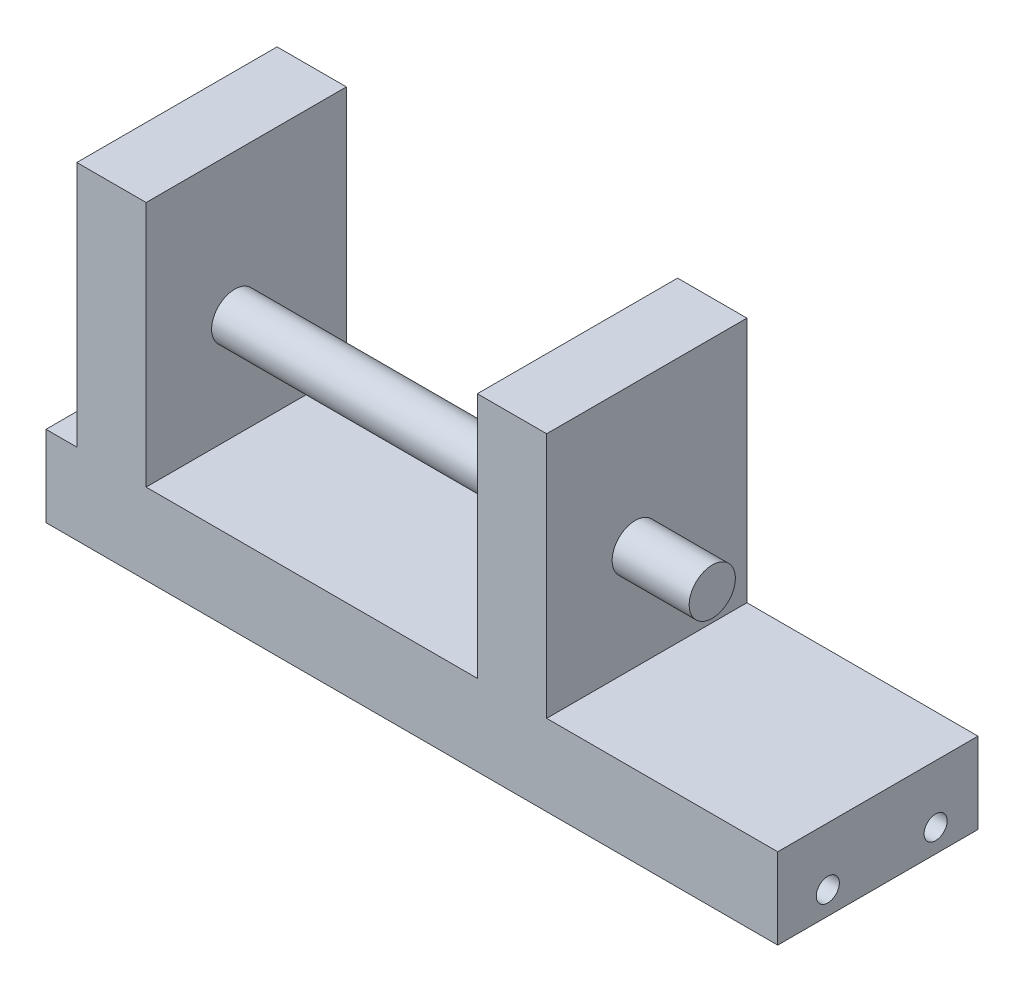
ISO-10303-21;
HEADER;
FILE_DESCRIPTION(('STEP AP214'),'2;1');
FILE_NAME('part.step','',(''),(''),'','','');
FILE_SCHEMA(('AUTOMOTIVE_DESIGN { 1 0 10303 214 1 1 1 1 }'));
ENDSEC;
DATA;
#1=APPLICATION_CONTEXT('core data for automotive mechanical design processes');
#2=APPLICATION_PROTOCOL_DEFINITION('international standard','automotive_design',2000,#1);
#3=PRODUCT_CONTEXT('',#1,'mechanical');
#4=PRODUCT('Part','Part','',(#3));
#5=PRODUCT_RELATED_PRODUCT_CATEGORY('part','',(#4));
#6=PRODUCT_DEFINITION_FORMATION('','',#4);
#7=PRODUCT_DEFINITION_CONTEXT('part definition',#1,'design');
#8=PRODUCT_DEFINITION('design','',#6,#7);
#9=PRODUCT_DEFINITION_SHAPE('','',#8);
#10=(LENGTH_UNIT() NAMED_UNIT(*) SI_UNIT(.MILLI.,.METRE.));
#11=(NAMED_UNIT(*) PLANE_ANGLE_UNIT() SI_UNIT($,.RADIAN.));
#12=(NAMED_UNIT(*) SI_UNIT($,.STERADIAN.) SOLID_ANGLE_UNIT());
#13=UNCERTAINTY_MEASURE_WITH_UNIT(LENGTH_MEASURE(1.E-05),#10,'distance_accuracy_value','');
#14=(GEOMETRIC_REPRESENTATION_CONTEXT(3) GLOBAL_UNCERTAINTY_ASSIGNED_CONTEXT((#13)) GLOBAL_UNIT_ASSIGNED_CONTEXT((#10,
#11,#12)) REPRESENTATION_CONTEXT('',''));
#15=CARTESIAN_POINT('',(0.,0.,0.));
#16=DIRECTION('',(0.,0.,1.));
#17=DIRECTION('',(1.,0.,0.));
#18=AXIS2_PLACEMENT_3D('',#15,#16,#17);
#19=CARTESIAN_POINT('',(-95.,10.5,26.));
#20=DIRECTION('',(0.,1.,0.));
#21=DIRECTION('',(0.,0.,1.));
#22=AXIS2_PLACEMENT_3D('',#19,#20,#21);
#23=PLANE('',#22);
#24=DIRECTION('',(1.,0.,0.));
#25=VECTOR('',#24,1.);
#26=CARTESIAN_POINT('',(-95.,10.5,26.));
#27=LINE('',#26,#25);
#28=CARTESIAN_POINT('',(-95.,10.5,26.));
#29=VERTEX_POINT('',#28);
#30=CARTESIAN_POINT('',(-91.,10.5,26.));
#31=VERTEX_POINT('',#30);
#32=EDGE_CURVE('E43',#29,#31,#27,.T.);
#33=ORIENTED_EDGE('',*,*,#32,.T.);
#34=DIRECTION('',(0.,0.,1.));
#35=VECTOR('',#34,1.);
#36=CARTESIAN_POINT('',(-91.,10.5,0.));
#37=LINE('',#36,#35);
#38=CARTESIAN_POINT('',(-91.,10.5,0.));
#39=VERTEX_POINT('',#38);
#40=EDGE_CURVE('E146',#39,#31,#37,.T.);
#41=ORIENTED_EDGE('',*,*,#40,.F.);
#42=DIRECTION('',(1.,0.,0.));
#43=VECTOR('',#42,1.);
#44=CARTESIAN_POINT('',(-95.,10.5,0.));
#45=LINE('',#44,#43);
#46=CARTESIAN_POINT('',(-95.,10.5,0.));
#47=VERTEX_POINT('',#46);
#48=EDGE_CURVE('E217',#47,#39,#45,.T.);
#49=ORIENTED_EDGE('',*,*,#48,.F.);
#50=DIRECTION('',(0.,0.,1.));
#51=VECTOR('',#50,1.);
#52=CARTESIAN_POINT('',(-95.,10.5,26.));
#53=LINE('',#52,#51);
#54=EDGE_CURVE('E200',#47,#29,#53,.T.);
#55=ORIENTED_EDGE('',*,*,#54,.T.);
#56=EDGE_LOOP('',(#33,#41,#49,#55));
#57=FACE_BOUND('',#56,.T.);
#58=ADVANCED_FACE('F35',(#57),#23,.T.);
#59=CARTESIAN_POINT('',(-82.,10.5,0.));
#60=VERTEX_POINT('',#59);
#61=CARTESIAN_POINT('',(-39.,10.5,0.));
#62=VERTEX_POINT('',#61);
#63=EDGE_CURVE('E220',#60,#62,#45,.T.);
#64=ORIENTED_EDGE('',*,*,#63,.F.);
#65=DIRECTION('',(0.,0.,-1.));
#66=VECTOR('',#65,1.);
#67=CARTESIAN_POINT('',(-82.,10.5,0.));
#68=LINE('',#67,#66);
#69=CARTESIAN_POINT('',(-82.,10.5,26.));
#70=VERTEX_POINT('',#69);
#71=EDGE_CURVE('E142',#70,#60,#68,.T.);
#72=ORIENTED_EDGE('',*,*,#71,.F.);
#73=CARTESIAN_POINT('',(-39.,10.5,26.));
#74=VERTEX_POINT('',#73);
#75=EDGE_CURVE('E215',#70,#74,#27,.T.);
#76=ORIENTED_EDGE('',*,*,#75,.T.);
#77=DIRECTION('',(0.,0.,1.));
#78=VECTOR('',#77,1.);
#79=CARTESIAN_POINT('',(-39.,10.5,0.));
#80=LINE('',#79,#78);
#81=EDGE_CURVE('E148',#62,#74,#80,.T.);
#82=ORIENTED_EDGE('',*,*,#81,.F.);
#83=EDGE_LOOP('',(#64,#72,#76,#82));
#84=FACE_BOUND('',#83,.T.);
#85=ADVANCED_FACE('F238',(#84),#23,.T.);
#86=CARTESIAN_POINT('',(-95.,10.5,26.));
#87=DIRECTION('',(0.,0.,1.));
#88=DIRECTION('',(1.,0.,0.));
#89=AXIS2_PLACEMENT_3D('',#86,#87,#88);
#90=PLANE('',#89);
#91=DIRECTION('',(0.,-1.,0.));
#92=VECTOR('',#91,1.);
#93=CARTESIAN_POINT('',(0.,10.5,26.));
#94=LINE('',#93,#92);
#95=CARTESIAN_POINT('',(0.,10.5,26.));
#96=VERTEX_POINT('',#95);
#97=CARTESIAN_POINT('',(0.,0.,26.));
#98=VERTEX_POINT('',#97);
#99=EDGE_CURVE('E187',#96,#98,#94,.T.);
#100=ORIENTED_EDGE('',*,*,#99,.F.);
#101=CARTESIAN_POINT('',(-30.,10.5,26.));
#102=VERTEX_POINT('',#101);
#103=EDGE_CURVE('E216',#102,#96,#27,.T.);
#104=ORIENTED_EDGE('',*,*,#103,.F.);
#105=DIRECTION('',(0.,-1.,0.));
#106=VECTOR('',#105,1.);
#107=CARTESIAN_POINT('',(-30.,42.5,26.));
#108=LINE('',#107,#106);
#109=CARTESIAN_POINT('',(-30.,42.5,26.));
#110=VERTEX_POINT('',#109);
#111=EDGE_CURVE('E171',#110,#102,#108,.T.);
#112=ORIENTED_EDGE('',*,*,#111,.F.);
#113=DIRECTION('',(1.,0.,0.));
#114=VECTOR('',#113,1.);
#115=CARTESIAN_POINT('',(-39.,42.5,26.));
#116=LINE('',#115,#114);
#117=CARTESIAN_POINT('',(-39.,42.5,26.));
#118=VERTEX_POINT('',#117);
#119=EDGE_CURVE('E158',#118,#110,#116,.T.);
#120=ORIENTED_EDGE('',*,*,#119,.F.);
#121=DIRECTION('',(0.,-1.,0.));
#122=VECTOR('',#121,1.);
#123=CARTESIAN_POINT('',(-39.,42.5,26.));
#124=LINE('',#123,#122);
#125=EDGE_CURVE('E174',#118,#74,#124,.T.);
#126=ORIENTED_EDGE('',*,*,#125,.T.);
#127=ORIENTED_EDGE('',*,*,#75,.F.);
#128=DIRECTION('',(0.,-1.,0.));
#129=VECTOR('',#128,1.);
#130=CARTESIAN_POINT('',(-82.,42.5,26.));
#131=LINE('',#130,#129);
#132=CARTESIAN_POINT('',(-82.,42.5,26.));
#133=VERTEX_POINT('',#132);
#134=EDGE_CURVE('E131',#133,#70,#131,.T.);
#135=ORIENTED_EDGE('',*,*,#134,.F.);
#136=DIRECTION('',(1.,0.,0.));
#137=VECTOR('',#136,1.);
#138=CARTESIAN_POINT('',(-91.,42.5,26.));
#139=LINE('',#138,#137);
#140=CARTESIAN_POINT('',(-91.,42.5,26.));
#141=VERTEX_POINT('',#140);
#142=EDGE_CURVE('E124',#141,#133,#139,.T.);
#143=ORIENTED_EDGE('',*,*,#142,.F.);
#144=DIRECTION('',(0.,-1.,0.));
#145=VECTOR('',#144,1.);
#146=CARTESIAN_POINT('',(-91.,42.5,26.));
#147=LINE('',#146,#145);
#148=EDGE_CURVE('E128',#141,#31,#147,.T.);
#149=ORIENTED_EDGE('',*,*,#148,.T.);
#150=ORIENTED_EDGE('',*,*,#32,.F.);
#151=DIRECTION('',(0.,-1.,0.));
#152=VECTOR('',#151,1.);
#153=CARTESIAN_POINT('',(-95.,10.5,26.));
#154=LINE('',#153,#152);
#155=CARTESIAN_POINT('',(-95.,0.,26.));
#156=VERTEX_POINT('',#155);
#157=EDGE_CURVE('E190',#29,#156,#154,.T.);
#158=ORIENTED_EDGE('',*,*,#157,.T.);
#159=DIRECTION('',(1.,0.,0.));
#160=VECTOR('',#159,1.);
#161=CARTESIAN_POINT('',(-95.,0.,26.));
#162=LINE('',#161,#160);
#163=EDGE_CURVE('E203',#156,#98,#162,.T.);
#164=ORIENTED_EDGE('',*,*,#163,.T.);
#165=EDGE_LOOP('',(#100,#104,#112,#120,#126,#127,#135,#143,#149,#150,#158,#164));
#166=FACE_BOUND('',#165,.T.);
#167=ADVANCED_FACE('F37',(#166),#90,.T.);
#168=DIRECTION('',(0.,0.,-1.));
#169=VECTOR('',#168,1.);
#170=CARTESIAN_POINT('',(-30.,10.5,0.));
#171=LINE('',#170,#169);
#172=CARTESIAN_POINT('',(-30.,10.5,0.));
#173=VERTEX_POINT('',#172);
#174=EDGE_CURVE('E58',#102,#173,#171,.T.);
#175=ORIENTED_EDGE('',*,*,#174,.F.);
#176=ORIENTED_EDGE('',*,*,#103,.T.);
#177=DIRECTION('',(0.,0.,1.));
#178=VECTOR('',#177,1.);
#179=CARTESIAN_POINT('',(0.,10.5,26.));
#180=LINE('',#179,#178);
#181=CARTESIAN_POINT('',(0.,10.5,0.));
#182=VERTEX_POINT('',#181);
#183=EDGE_CURVE('E194',#182,#96,#180,.T.);
#184=ORIENTED_EDGE('',*,*,#183,.F.);
#185=EDGE_CURVE('E221',#173,#182,#45,.T.);
#186=ORIENTED_EDGE('',*,*,#185,.F.);
#187=EDGE_LOOP('',(#175,#176,#184,#186));
#188=FACE_BOUND('',#187,.T.);
#189=ADVANCED_FACE('F232',(#188),#23,.T.);
#190=CARTESIAN_POINT('',(-95.,10.5,0.));
#191=DIRECTION('',(0.,0.,-1.));
#192=DIRECTION('',(-1.,0.,0.));
#193=AXIS2_PLACEMENT_3D('',#190,#191,#192);
#194=PLANE('',#193);
#195=DIRECTION('',(0.,1.,0.));
#196=VECTOR('',#195,1.);
#197=CARTESIAN_POINT('',(0.,10.5,0.));
#198=LINE('',#197,#196);
#199=CARTESIAN_POINT('',(0.,0.,0.));
#200=VERTEX_POINT('',#199);
#201=EDGE_CURVE('E209',#200,#182,#198,.T.);
#202=ORIENTED_EDGE('',*,*,#201,.F.);
#203=DIRECTION('',(1.,0.,0.));
#204=VECTOR('',#203,1.);
#205=CARTESIAN_POINT('',(-95.,0.,0.));
#206=LINE('',#205,#204);
#207=CARTESIAN_POINT('',(-95.,0.,0.));
#208=VERTEX_POINT('',#207);
#209=EDGE_CURVE('E222',#208,#200,#206,.T.);
#210=ORIENTED_EDGE('',*,*,#209,.F.);
#211=DIRECTION('',(0.,1.,0.));
#212=VECTOR('',#211,1.);
#213=CARTESIAN_POINT('',(-95.,10.5,0.));
#214=LINE('',#213,#212);
#215=EDGE_CURVE('E197',#208,#47,#214,.T.);
#216=ORIENTED_EDGE('',*,*,#215,.T.);
#217=ORIENTED_EDGE('',*,*,#48,.T.);
#218=DIRECTION('',(0.,-1.,0.));
#219=VECTOR('',#218,1.);
#220=CARTESIAN_POINT('',(-91.,42.5,0.));
#221=LINE('',#220,#219);
#222=CARTESIAN_POINT('',(-91.,42.5,0.));
#223=VERTEX_POINT('',#222);
#224=EDGE_CURVE('E430',#223,#39,#221,.T.);
#225=ORIENTED_EDGE('',*,*,#224,.F.);
#226=DIRECTION('',(-1.,0.,0.));
#227=VECTOR('',#226,1.);
#228=CARTESIAN_POINT('',(-91.,42.5,0.));
#229=LINE('',#228,#227);
#230=CARTESIAN_POINT('',(-82.,42.5,0.));
#231=VERTEX_POINT('',#230);
#232=EDGE_CURVE('E139',#231,#223,#229,.T.);
#233=ORIENTED_EDGE('',*,*,#232,.F.);
#234=DIRECTION('',(0.,-1.,0.));
#235=VECTOR('',#234,1.);
#236=CARTESIAN_POINT('',(-82.,42.5,0.));
#237=LINE('',#236,#235);
#238=EDGE_CURVE('E50',#231,#60,#237,.T.);
#239=ORIENTED_EDGE('',*,*,#238,.T.);
#240=ORIENTED_EDGE('',*,*,#63,.T.);
#241=DIRECTION('',(0.,-1.,0.));
#242=VECTOR('',#241,1.);
#243=CARTESIAN_POINT('',(-39.,42.5,0.));
#244=LINE('',#243,#242);
#245=CARTESIAN_POINT('',(-39.,42.5,0.));
#246=VERTEX_POINT('',#245);
#247=EDGE_CURVE('E163',#246,#62,#244,.T.);
#248=ORIENTED_EDGE('',*,*,#247,.F.);
#249=DIRECTION('',(-1.,0.,0.));
#250=VECTOR('',#249,1.);
#251=CARTESIAN_POINT('',(-39.,42.5,0.));
#252=LINE('',#251,#250);
#253=CARTESIAN_POINT('',(-30.,42.5,0.));
#254=VERTEX_POINT('',#253);
#255=EDGE_CURVE('E162',#254,#246,#252,.T.);
#256=ORIENTED_EDGE('',*,*,#255,.F.);
#257=DIRECTION('',(0.,-1.,0.));
#258=VECTOR('',#257,1.);
#259=CARTESIAN_POINT('',(-30.,42.5,0.));
#260=LINE('',#259,#258);
#261=EDGE_CURVE('E168',#254,#173,#260,.T.);
#262=ORIENTED_EDGE('',*,*,#261,.T.);
#263=ORIENTED_EDGE('',*,*,#185,.T.);
#264=EDGE_LOOP('',(#202,#210,#216,#217,#225,#233,#239,#240,#248,#256,#262,#263));
#265=FACE_BOUND('',#264,.T.);
#266=ADVANCED_FACE('F245',(#265),#194,.T.);
#267=CARTESIAN_POINT('',(-95.,0.,26.));
#268=DIRECTION('',(0.,-1.,0.));
#269=DIRECTION('',(0.,0.,-1.));
#270=AXIS2_PLACEMENT_3D('',#267,#268,#269);
#271=PLANE('',#270);
#272=DIRECTION('',(0.,0.,-1.));
#273=VECTOR('',#272,1.);
#274=CARTESIAN_POINT('',(0.,0.,26.));
#275=LINE('',#274,#273);
#276=EDGE_CURVE('E206',#98,#200,#275,.T.);
#277=ORIENTED_EDGE('',*,*,#276,.F.);
#278=ORIENTED_EDGE('',*,*,#163,.F.);
#279=DIRECTION('',(0.,0.,-1.));
#280=VECTOR('',#279,1.);
#281=CARTESIAN_POINT('',(-95.,0.,26.));
#282=LINE('',#281,#280);
#283=EDGE_CURVE('E193',#156,#208,#282,.T.);
#284=ORIENTED_EDGE('',*,*,#283,.T.);
#285=ORIENTED_EDGE('',*,*,#209,.T.);
#286=EDGE_LOOP('',(#277,#278,#284,#285));
#287=FACE_BOUND('',#286,.T.);
#288=ADVANCED_FACE('F227',(#287),#271,.T.);
#289=CARTESIAN_POINT('',(-95.,0.,0.));
#290=DIRECTION('',(1.,0.,0.));
#291=DIRECTION('',(0.,0.,-1.));
#292=AXIS2_PLACEMENT_3D('',#289,#290,#291);
#293=PLANE('',#292);
#294=CARTESIAN_POINT('',(-95.,3.,5.5));
#295=DIRECTION('',(1.,0.,0.));
#296=DIRECTION('',(0.,0.,-1.));
#297=AXIS2_PLACEMENT_3D('',#294,#295,#296);
#298=CIRCLE('',#297,1.5);
#299=CARTESIAN_POINT('',(-95.,3.,4.));
#300=VERTEX_POINT('',#299);
#301=EDGE_CURVE('E178',#300,#300,#298,.T.);
#302=ORIENTED_EDGE('',*,*,#301,.T.);
#303=EDGE_LOOP('',(#302));
#304=FACE_BOUND('',#303,.T.);
#305=CARTESIAN_POINT('',(-95.,3.,19.5));
#306=DIRECTION('',(1.,0.,0.));
#307=DIRECTION('',(0.,0.,-1.));
#308=AXIS2_PLACEMENT_3D('',#305,#306,#307);
#309=CIRCLE('',#308,1.5);
#310=CARTESIAN_POINT('',(-95.,3.,18.));
#311=VERTEX_POINT('',#310);
#312=EDGE_CURVE('E184',#311,#311,#309,.T.);
#313=ORIENTED_EDGE('',*,*,#312,.T.);
#314=EDGE_LOOP('',(#313));
#315=FACE_BOUND('',#314,.T.);
#316=ORIENTED_EDGE('',*,*,#157,.F.);
#317=ORIENTED_EDGE('',*,*,#54,.F.);
#318=ORIENTED_EDGE('',*,*,#215,.F.);
#319=ORIENTED_EDGE('',*,*,#283,.F.);
#320=EDGE_LOOP('',(#316,#317,#318,#319));
#321=FACE_BOUND('',#320,.T.);
#322=ADVANCED_FACE('F316',(#304,#315,#321),#293,.F.);
#323=CARTESIAN_POINT('',(0.,0.,0.));
#324=DIRECTION('',(1.,0.,0.));
#325=DIRECTION('',(0.,0.,-1.));
#326=AXIS2_PLACEMENT_3D('',#323,#324,#325);
#327=PLANE('',#326);
#328=CARTESIAN_POINT('',(0.,3.,5.5));
#329=DIRECTION('',(1.,0.,0.));
#330=DIRECTION('',(0.,0.,-1.));
#331=AXIS2_PLACEMENT_3D('',#328,#329,#330);
#332=CIRCLE('',#331,1.5);
#333=CARTESIAN_POINT('',(0.,3.,4.));
#334=VERTEX_POINT('',#333);
#335=EDGE_CURVE('E177',#334,#334,#332,.T.);
#336=ORIENTED_EDGE('',*,*,#335,.F.);
#337=EDGE_LOOP('',(#336));
#338=FACE_BOUND('',#337,.T.);
#339=CARTESIAN_POINT('',(0.,3.,19.5));
#340=DIRECTION('',(1.,0.,0.));
#341=DIRECTION('',(0.,0.,-1.));
#342=AXIS2_PLACEMENT_3D('',#339,#340,#341);
#343=CIRCLE('',#342,1.5);
#344=CARTESIAN_POINT('',(0.,3.,18.));
#345=VERTEX_POINT('',#344);
#346=EDGE_CURVE('E181',#345,#345,#343,.T.);
#347=ORIENTED_EDGE('',*,*,#346,.F.);
#348=EDGE_LOOP('',(#347));
#349=FACE_BOUND('',#348,.T.);
#350=ORIENTED_EDGE('',*,*,#99,.T.);
#351=ORIENTED_EDGE('',*,*,#276,.T.);
#352=ORIENTED_EDGE('',*,*,#201,.T.);
#353=ORIENTED_EDGE('',*,*,#183,.T.);
#354=EDGE_LOOP('',(#350,#351,#352,#353));
#355=FACE_BOUND('',#354,.T.);
#356=ADVANCED_FACE('F230',(#338,#349,#355),#327,.T.);
#357=CARTESIAN_POINT('',(-95.,3.,19.5));
#358=DIRECTION('',(1.,0.,0.));
#359=DIRECTION('',(0.,0.,-1.));
#360=AXIS2_PLACEMENT_3D('',#357,#358,#359);
#361=CYLINDRICAL_SURFACE('',#360,1.5);
#362=ORIENTED_EDGE('',*,*,#312,.F.);
#363=EDGE_LOOP('',(#362));
#364=FACE_BOUND('',#363,.T.);
#365=ORIENTED_EDGE('',*,*,#346,.T.);
#366=EDGE_LOOP('',(#365));
#367=FACE_BOUND('',#366,.T.);
#368=ADVANCED_FACE('F296',(#364,#367),#361,.F.);
#369=CARTESIAN_POINT('',(-95.,3.,5.5));
#370=DIRECTION('',(1.,0.,0.));
#371=DIRECTION('',(0.,0.,-1.));
#372=AXIS2_PLACEMENT_3D('',#369,#370,#371);
#373=CYLINDRICAL_SURFACE('',#372,1.5);
#374=ORIENTED_EDGE('',*,*,#301,.F.);
#375=EDGE_LOOP('',(#374));
#376=FACE_BOUND('',#375,.T.);
#377=ORIENTED_EDGE('',*,*,#335,.T.);
#378=EDGE_LOOP('',(#377));
#379=FACE_BOUND('',#378,.T.);
#380=ADVANCED_FACE('F292',(#376,#379),#373,.F.);
#381=CARTESIAN_POINT('',(-39.,42.5,0.));
#382=DIRECTION('',(1.,0.,0.));
#383=DIRECTION('',(0.,0.,-1.));
#384=AXIS2_PLACEMENT_3D('',#381,#382,#383);
#385=PLANE('',#384);
#386=CARTESIAN_POINT('',(-39.,24.,14.5));
#387=DIRECTION('',(1.,0.,0.));
#388=DIRECTION('',(0.,0.,-1.));
#389=AXIS2_PLACEMENT_3D('',#386,#387,#388);
#390=CIRCLE('',#389,3.);
#391=CARTESIAN_POINT('',(-39.,24.,11.5));
#392=VERTEX_POINT('',#391);
#393=EDGE_CURVE('E423',#392,#392,#390,.T.);
#394=ORIENTED_EDGE('',*,*,#393,.T.);
#395=EDGE_LOOP('',(#394));
#396=FACE_BOUND('',#395,.T.);
#397=ORIENTED_EDGE('',*,*,#81,.T.);
#398=ORIENTED_EDGE('',*,*,#125,.F.);
#399=DIRECTION('',(0.,0.,1.));
#400=VECTOR('',#399,1.);
#401=CARTESIAN_POINT('',(-39.,42.5,0.));
#402=LINE('',#401,#400);
#403=EDGE_CURVE('E155',#246,#118,#402,.T.);
#404=ORIENTED_EDGE('',*,*,#403,.F.);
#405=ORIENTED_EDGE('',*,*,#247,.T.);
#406=EDGE_LOOP('',(#397,#398,#404,#405));
#407=FACE_BOUND('',#406,.T.);
#408=ADVANCED_FACE('F242',(#396,#407),#385,.F.);
#409=CARTESIAN_POINT('',(-30.,42.5,0.));
#410=DIRECTION('',(-1.,0.,0.));
#411=DIRECTION('',(0.,0.,1.));
#412=AXIS2_PLACEMENT_3D('',#409,#410,#411);
#413=PLANE('',#412);
#414=CARTESIAN_POINT('',(-30.,24.,14.5));
#415=DIRECTION('',(-1.,0.,0.));
#416=DIRECTION('',(0.,0.,1.));
#417=AXIS2_PLACEMENT_3D('',#414,#415,#416);
#418=CIRCLE('',#417,3.);
#419=CARTESIAN_POINT('',(-30.,24.,17.5));
#420=VERTEX_POINT('',#419);
#421=EDGE_CURVE('E11',#420,#420,#418,.F.);
#422=ORIENTED_EDGE('',*,*,#421,.F.);
#423=EDGE_LOOP('',(#422));
#424=FACE_BOUND('',#423,.T.);
#425=ORIENTED_EDGE('',*,*,#174,.T.);
#426=ORIENTED_EDGE('',*,*,#261,.F.);
#427=DIRECTION('',(0.,0.,-1.));
#428=VECTOR('',#427,1.);
#429=CARTESIAN_POINT('',(-30.,42.5,0.));
#430=LINE('',#429,#428);
#431=EDGE_CURVE('E160',#110,#254,#430,.T.);
#432=ORIENTED_EDGE('',*,*,#431,.F.);
#433=ORIENTED_EDGE('',*,*,#111,.T.);
#434=EDGE_LOOP('',(#425,#426,#432,#433));
#435=FACE_BOUND('',#434,.T.);
#436=ADVANCED_FACE('F249',(#424,#435),#413,.F.);
#437=CARTESIAN_POINT('',(0.,42.5,0.));
#438=DIRECTION('',(0.,1.,0.));
#439=DIRECTION('',(0.,0.,1.));
#440=AXIS2_PLACEMENT_3D('',#437,#438,#439);
#441=PLANE('',#440);
#442=ORIENTED_EDGE('',*,*,#403,.T.);
#443=ORIENTED_EDGE('',*,*,#119,.T.);
#444=ORIENTED_EDGE('',*,*,#431,.T.);
#445=ORIENTED_EDGE('',*,*,#255,.T.);
#446=EDGE_LOOP('',(#442,#443,#444,#445));
#447=FACE_BOUND('',#446,.T.);
#448=ADVANCED_FACE('F251',(#447),#441,.T.);
#449=CARTESIAN_POINT('',(-91.,42.5,0.));
#450=DIRECTION('',(1.,0.,0.));
#451=DIRECTION('',(0.,0.,-1.));
#452=AXIS2_PLACEMENT_3D('',#449,#450,#451);
#453=PLANE('',#452);
#454=ORIENTED_EDGE('',*,*,#40,.T.);
#455=ORIENTED_EDGE('',*,*,#148,.F.);
#456=DIRECTION('',(0.,0.,1.));
#457=VECTOR('',#456,1.);
#458=CARTESIAN_POINT('',(-91.,42.5,0.));
#459=LINE('',#458,#457);
#460=EDGE_CURVE('E135',#223,#141,#459,.T.);
#461=ORIENTED_EDGE('',*,*,#460,.F.);
#462=ORIENTED_EDGE('',*,*,#224,.T.);
#463=EDGE_LOOP('',(#454,#455,#461,#462));
#464=FACE_BOUND('',#463,.T.);
#465=ADVANCED_FACE('F144',(#464),#453,.F.);
#466=CARTESIAN_POINT('',(-82.,42.5,0.));
#467=DIRECTION('',(-1.,0.,0.));
#468=DIRECTION('',(0.,0.,1.));
#469=AXIS2_PLACEMENT_3D('',#466,#467,#468);
#470=PLANE('',#469);
#471=CARTESIAN_POINT('',(-82.,24.,14.5));
#472=DIRECTION('',(-1.,0.,0.));
#473=DIRECTION('',(0.,0.,1.));
#474=AXIS2_PLACEMENT_3D('',#471,#472,#473);
#475=CIRCLE('',#474,3.);
#476=CARTESIAN_POINT('',(-82.,24.,17.5));
#477=VERTEX_POINT('',#476);
#478=EDGE_CURVE('E420',#477,#477,#475,.F.);
#479=ORIENTED_EDGE('',*,*,#478,.F.);
#480=EDGE_LOOP('',(#479));
#481=FACE_BOUND('',#480,.T.);
#482=ORIENTED_EDGE('',*,*,#71,.T.);
#483=ORIENTED_EDGE('',*,*,#238,.F.);
#484=DIRECTION('',(0.,0.,-1.));
#485=VECTOR('',#484,1.);
#486=CARTESIAN_POINT('',(-82.,42.5,0.));
#487=LINE('',#486,#485);
#488=EDGE_CURVE('E134',#133,#231,#487,.T.);
#489=ORIENTED_EDGE('',*,*,#488,.F.);
#490=ORIENTED_EDGE('',*,*,#134,.T.);
#491=EDGE_LOOP('',(#482,#483,#489,#490));
#492=FACE_BOUND('',#491,.T.);
#493=ADVANCED_FACE('F258',(#481,#492),#470,.F.);
#494=CARTESIAN_POINT('',(0.,42.5,0.));
#495=DIRECTION('',(0.,1.,0.));
#496=DIRECTION('',(0.,0.,1.));
#497=AXIS2_PLACEMENT_3D('',#494,#495,#496);
#498=PLANE('',#497);
#499=ORIENTED_EDGE('',*,*,#460,.T.);
#500=ORIENTED_EDGE('',*,*,#142,.T.);
#501=ORIENTED_EDGE('',*,*,#488,.T.);
#502=ORIENTED_EDGE('',*,*,#232,.T.);
#503=EDGE_LOOP('',(#499,#500,#501,#502));
#504=FACE_BOUND('',#503,.T.);
#505=ADVANCED_FACE('F138',(#504),#498,.T.);
#506=CARTESIAN_POINT('',(-90.4852813742386,24.,14.5));
#507=DIRECTION('',(1.,0.,0.));
#508=DIRECTION('',(0.,0.,-1.));
#509=AXIS2_PLACEMENT_3D('',#506,#507,#508);
#510=CYLINDRICAL_SURFACE('',#509,3.);
#511=ORIENTED_EDGE('',*,*,#478,.T.);
#512=EDGE_LOOP('',(#511));
#513=FACE_BOUND('',#512,.T.);
#514=ORIENTED_EDGE('',*,*,#393,.F.);
#515=EDGE_LOOP('',(#514));
#516=FACE_BOUND('',#515,.T.);
#517=ADVANCED_FACE('F365',(#513,#516),#510,.T.);
#518=CARTESIAN_POINT('',(-20.,24.,14.5));
#519=DIRECTION('',(-1.,0.,0.));
#520=DIRECTION('',(0.,0.,1.));
#521=AXIS2_PLACEMENT_3D('',#518,#519,#520);
#522=CYLINDRICAL_SURFACE('',#521,3.);
#523=CARTESIAN_POINT('',(-20.,24.,14.5));
#524=DIRECTION('',(1.,0.,0.));
#525=DIRECTION('',(0.,0.,-1.));
#526=AXIS2_PLACEMENT_3D('',#523,#524,#525);
#527=CIRCLE('',#526,3.);
#528=CARTESIAN_POINT('',(-20.,24.,11.5));
#529=VERTEX_POINT('',#528);
#530=EDGE_CURVE('E419',#529,#529,#527,.T.);
#531=ORIENTED_EDGE('',*,*,#530,.F.);
#532=EDGE_LOOP('',(#531));
#533=FACE_BOUND('',#532,.T.);
#534=ORIENTED_EDGE('',*,*,#421,.T.);
#535=EDGE_LOOP('',(#534));
#536=FACE_BOUND('',#535,.T.);
#537=ADVANCED_FACE('F388',(#533,#536),#522,.T.);
#538=CARTESIAN_POINT('',(-20.,24.,14.5));
#539=DIRECTION('',(1.,0.,0.));
#540=DIRECTION('',(0.,0.,-1.));
#541=AXIS2_PLACEMENT_3D('',#538,#539,#540);
#542=PLANE('',#541);
#543=ORIENTED_EDGE('',*,*,#530,.T.);
#544=EDGE_LOOP('',(#543));
#545=FACE_BOUND('',#544,.T.);
#546=ADVANCED_FACE('F403',(#545),#542,.T.);
#547=CLOSED_SHELL('',(#58,#85,#167,#189,#266,#288,#322,#356,#368,#380,#408,#436,#448,#465,#493,
#505,#517,#537,#546));
#548=MANIFOLD_SOLID_BREP('B2',#547);
#549=ADVANCED_BREP_SHAPE_REPRESENTATION('',(#18,#548),#14);
#550=SHAPE_DEFINITION_REPRESENTATION(#9,#549);
ENDSEC;
END-ISO-10303-21;
